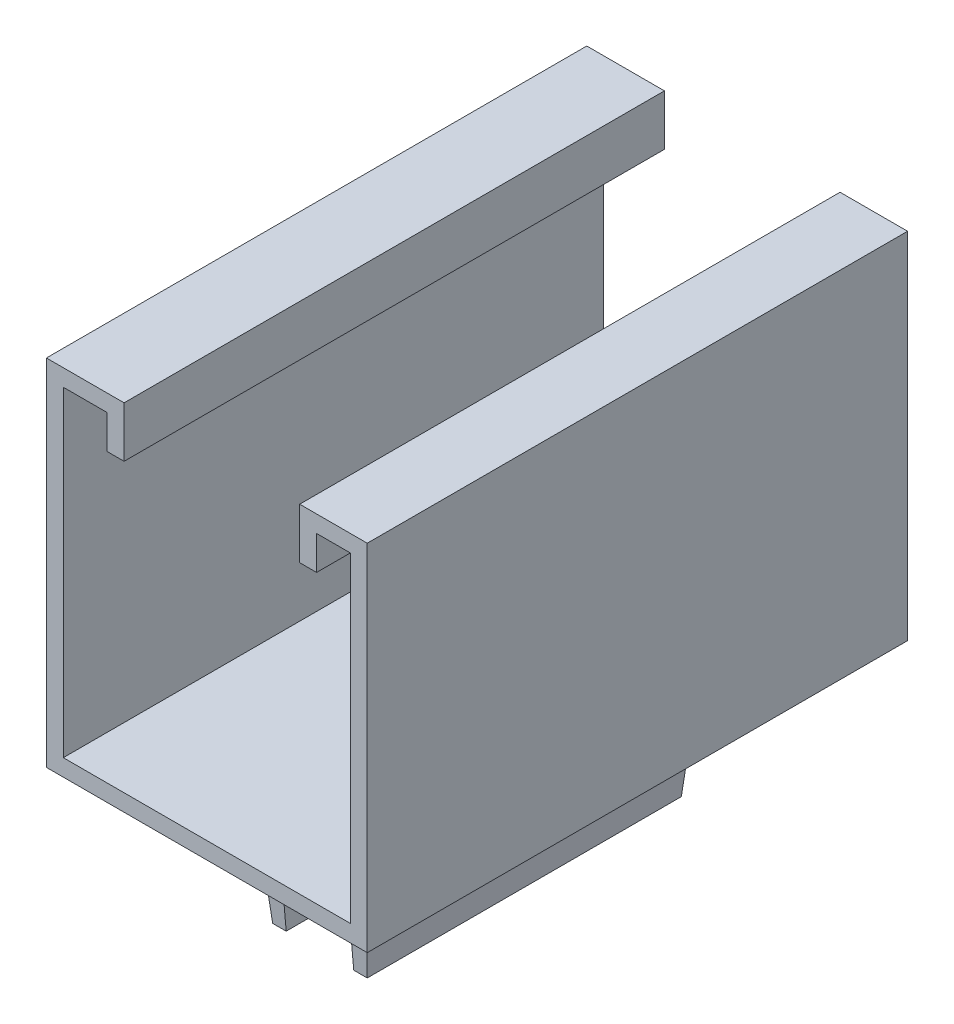
ISO-10303-21;
HEADER;
FILE_DESCRIPTION(('STEP AP214'),'2;1');
FILE_NAME('part.step','',(''),(''),'','','');
FILE_SCHEMA(('AUTOMOTIVE_DESIGN { 1 0 10303 214 1 1 1 1 }'));
ENDSEC;
DATA;
#1=APPLICATION_CONTEXT('core data for automotive mechanical design processes');
#2=APPLICATION_PROTOCOL_DEFINITION('international standard','automotive_design',2000,#1);
#3=PRODUCT_CONTEXT('',#1,'mechanical');
#4=PRODUCT('Part','Part','',(#3));
#5=PRODUCT_RELATED_PRODUCT_CATEGORY('part','',(#4));
#6=PRODUCT_DEFINITION_FORMATION('','',#4);
#7=PRODUCT_DEFINITION_CONTEXT('part definition',#1,'design');
#8=PRODUCT_DEFINITION('design','',#6,#7);
#9=PRODUCT_DEFINITION_SHAPE('','',#8);
#10=(LENGTH_UNIT() NAMED_UNIT(*) SI_UNIT(.MILLI.,.METRE.));
#11=(NAMED_UNIT(*) PLANE_ANGLE_UNIT() SI_UNIT($,.RADIAN.));
#12=(NAMED_UNIT(*) SI_UNIT($,.STERADIAN.) SOLID_ANGLE_UNIT());
#13=UNCERTAINTY_MEASURE_WITH_UNIT(LENGTH_MEASURE(1.E-05),#10,'distance_accuracy_value','');
#14=(GEOMETRIC_REPRESENTATION_CONTEXT(3) GLOBAL_UNCERTAINTY_ASSIGNED_CONTEXT((#13)) GLOBAL_UNIT_ASSIGNED_CONTEXT((#10,
#11,#12)) REPRESENTATION_CONTEXT('',''));
#15=CARTESIAN_POINT('',(0.,0.,0.));
#16=DIRECTION('',(0.,0.,1.));
#17=DIRECTION('',(1.,0.,0.));
#18=AXIS2_PLACEMENT_3D('',#15,#16,#17);
#19=CARTESIAN_POINT('',(15.875,-63.5,82.55));
#20=DIRECTION('',(0.,-0.0871557427476584,0.996194698091746));
#21=DIRECTION('',(0.,-0.996194698091746,-0.0871557427476584));
#22=AXIS2_PLACEMENT_3D('',#19,#20,#21);
#23=PLANE('',#22);
#24=DIRECTION('',(1.,0.,0.));
#25=VECTOR('',#24,1.);
#26=CARTESIAN_POINT('',(0.,-88.9,80.3277879464415));
#27=LINE('',#26,#25);
#28=CARTESIAN_POINT('',(18.0972120535585,-88.9,80.3277879464415));
#29=VERTEX_POINT('',#28);
#30=CARTESIAN_POINT('',(20.6375,-88.9,80.3277879464415));
#31=VERTEX_POINT('',#30);
#32=EDGE_CURVE('E228',#29,#31,#27,.T.);
#33=ORIENTED_EDGE('',*,*,#32,.T.);
#34=DIRECTION('',(0.,0.996194698091746,0.0871557427476584));
#35=VECTOR('',#34,1.);
#36=CARTESIAN_POINT('',(20.6375,-63.5,82.55));
#37=LINE('',#36,#35);
#38=CARTESIAN_POINT('',(20.6375,-63.5,82.55));
#39=VERTEX_POINT('',#38);
#40=EDGE_CURVE('E212',#31,#39,#37,.T.);
#41=ORIENTED_EDGE('',*,*,#40,.T.);
#42=DIRECTION('',(1.,0.,0.));
#43=VECTOR('',#42,1.);
#44=CARTESIAN_POINT('',(15.875,-63.5,82.55));
#45=LINE('',#44,#43);
#46=CARTESIAN_POINT('',(15.875,-63.5,82.55));
#47=VERTEX_POINT('',#46);
#48=EDGE_CURVE('E226',#47,#39,#45,.T.);
#49=ORIENTED_EDGE('',*,*,#48,.F.);
#50=DIRECTION('',(0.0868265938642475,-0.992432509138967,-0.0868265938642478));
#51=VECTOR('',#50,1.);
#52=CARTESIAN_POINT('',(15.875,-63.5,82.55));
#53=LINE('',#52,#51);
#54=EDGE_CURVE('E251',#29,#47,#53,.F.);
#55=ORIENTED_EDGE('',*,*,#54,.F.);
#56=EDGE_LOOP('',(#33,#41,#49,#55));
#57=FACE_BOUND('',#56,.T.);
#58=ADVANCED_FACE('F45',(#57),#23,.T.);
#59=CARTESIAN_POINT('',(15.875,-63.5,19.05));
#60=DIRECTION('',(0.,-0.0871557427476584,-0.996194698091746));
#61=DIRECTION('',(0.,0.996194698091746,-0.0871557427476584));
#62=AXIS2_PLACEMENT_3D('',#59,#60,#61);
#63=PLANE('',#62);
#64=DIRECTION('',(0.,-0.996194698091746,0.0871557427476584));
#65=VECTOR('',#64,1.);
#66=CARTESIAN_POINT('',(20.6375,-63.5,19.05));
#67=LINE('',#66,#65);
#68=CARTESIAN_POINT('',(20.6375,-88.9,21.2722120535585));
#69=VERTEX_POINT('',#68);
#70=CARTESIAN_POINT('',(20.6375,-63.5,19.05));
#71=VERTEX_POINT('',#70);
#72=EDGE_CURVE('E215',#69,#71,#67,.F.);
#73=ORIENTED_EDGE('',*,*,#72,.F.);
#74=DIRECTION('',(-1.,0.,0.));
#75=VECTOR('',#74,1.);
#76=CARTESIAN_POINT('',(0.,-88.9,21.2722120535585));
#77=LINE('',#76,#75);
#78=CARTESIAN_POINT('',(18.0972120535585,-88.9,21.2722120535585));
#79=VERTEX_POINT('',#78);
#80=EDGE_CURVE('E272',#79,#69,#77,.F.);
#81=ORIENTED_EDGE('',*,*,#80,.F.);
#82=DIRECTION('',(-0.0868265938642475,0.992432509138967,-0.0868265938642478));
#83=VECTOR('',#82,1.);
#84=CARTESIAN_POINT('',(15.875,-63.5,19.05));
#85=LINE('',#84,#83);
#86=CARTESIAN_POINT('',(15.875,-63.5,19.05));
#87=VERTEX_POINT('',#86);
#88=EDGE_CURVE('E255',#79,#87,#85,.T.);
#89=ORIENTED_EDGE('',*,*,#88,.T.);
#90=DIRECTION('',(1.,0.,0.));
#91=VECTOR('',#90,1.);
#92=CARTESIAN_POINT('',(15.875,-63.5,19.05));
#93=LINE('',#92,#91);
#94=EDGE_CURVE('E245',#87,#71,#93,.T.);
#95=ORIENTED_EDGE('',*,*,#94,.T.);
#96=EDGE_LOOP('',(#73,#81,#89,#95));
#97=FACE_BOUND('',#96,.T.);
#98=ADVANCED_FACE('F525',(#97),#63,.T.);
#99=CARTESIAN_POINT('',(0.,-88.9,0.));
#100=DIRECTION('',(0.,1.,0.));
#101=DIRECTION('',(-1.,0.,0.));
#102=AXIS2_PLACEMENT_3D('',#99,#100,#101);
#103=PLANE('',#102);
#104=DIRECTION('',(0.,0.,-1.));
#105=VECTOR('',#104,1.);
#106=CARTESIAN_POINT('',(20.6375,-88.9,0.));
#107=LINE('',#106,#105);
#108=EDGE_CURVE('E11',#31,#69,#107,.T.);
#109=ORIENTED_EDGE('',*,*,#108,.F.);
#110=ORIENTED_EDGE('',*,*,#32,.F.);
#111=DIRECTION('',(0.,0.,1.));
#112=VECTOR('',#111,1.);
#113=CARTESIAN_POINT('',(18.0972120535585,-88.9,0.));
#114=LINE('',#113,#112);
#115=EDGE_CURVE('E260',#29,#79,#114,.F.);
#116=ORIENTED_EDGE('',*,*,#115,.T.);
#117=ORIENTED_EDGE('',*,*,#80,.T.);
#118=EDGE_LOOP('',(#109,#110,#116,#117));
#119=FACE_BOUND('',#118,.T.);
#120=ADVANCED_FACE('F512',(#119),#103,.F.);
#121=CARTESIAN_POINT('',(0.,0.,101.6));
#122=DIRECTION('',(0.,1.,0.));
#123=DIRECTION('',(0.,0.,1.));
#124=AXIS2_PLACEMENT_3D('',#121,#122,#123);
#125=PLANE('',#124);
#126=DIRECTION('',(1.,0.,0.));
#127=VECTOR('',#126,1.);
#128=CARTESIAN_POINT('',(0.,0.,0.));
#129=LINE('',#128,#127);
#130=CARTESIAN_POINT('',(0.,0.,0.));
#131=VERTEX_POINT('',#130);
#132=CARTESIAN_POINT('',(8.255,0.,0.));
#133=VERTEX_POINT('',#132);
#134=EDGE_CURVE('E254',#131,#133,#129,.T.);
#135=ORIENTED_EDGE('',*,*,#134,.T.);
#136=DIRECTION('',(0.,0.,-1.));
#137=VECTOR('',#136,1.);
#138=CARTESIAN_POINT('',(8.255,0.,101.6));
#139=LINE('',#138,#137);
#140=CARTESIAN_POINT('',(8.255,0.,101.6));
#141=VERTEX_POINT('',#140);
#142=EDGE_CURVE('E437',#141,#133,#139,.T.);
#143=ORIENTED_EDGE('',*,*,#142,.F.);
#144=DIRECTION('',(1.,0.,0.));
#145=VECTOR('',#144,1.);
#146=CARTESIAN_POINT('',(0.,0.,101.6));
#147=LINE('',#146,#145);
#148=CARTESIAN_POINT('',(0.,0.,101.6));
#149=VERTEX_POINT('',#148);
#150=EDGE_CURVE('E280',#149,#141,#147,.T.);
#151=ORIENTED_EDGE('',*,*,#150,.F.);
#152=DIRECTION('',(0.,0.,-1.));
#153=VECTOR('',#152,1.);
#154=CARTESIAN_POINT('',(0.,0.,101.6));
#155=LINE('',#154,#153);
#156=EDGE_CURVE('E330',#149,#131,#155,.T.);
#157=ORIENTED_EDGE('',*,*,#156,.T.);
#158=EDGE_LOOP('',(#135,#143,#151,#157));
#159=FACE_BOUND('',#158,.T.);
#160=ADVANCED_FACE('F47',(#159),#125,.F.);
#161=CARTESIAN_POINT('',(8.255,0.,101.6));
#162=DIRECTION('',(1.,0.,0.));
#163=DIRECTION('',(0.,0.,-1.));
#164=AXIS2_PLACEMENT_3D('',#161,#162,#163);
#165=PLANE('',#164);
#166=DIRECTION('',(0.,-1.,0.));
#167=VECTOR('',#166,1.);
#168=CARTESIAN_POINT('',(8.255,0.,0.));
#169=LINE('',#168,#167);
#170=CARTESIAN_POINT('',(8.255,-6.35,0.));
#171=VERTEX_POINT('',#170);
#172=EDGE_CURVE('E334',#133,#171,#169,.T.);
#173=ORIENTED_EDGE('',*,*,#172,.T.);
#174=DIRECTION('',(0.,0.,-1.));
#175=VECTOR('',#174,1.);
#176=CARTESIAN_POINT('',(8.255,-6.35,101.6));
#177=LINE('',#176,#175);
#178=CARTESIAN_POINT('',(8.255,-6.35,101.6));
#179=VERTEX_POINT('',#178);
#180=EDGE_CURVE('E433',#179,#171,#177,.T.);
#181=ORIENTED_EDGE('',*,*,#180,.F.);
#182=DIRECTION('',(0.,-1.,0.));
#183=VECTOR('',#182,1.);
#184=CARTESIAN_POINT('',(8.255,0.,101.6));
#185=LINE('',#184,#183);
#186=EDGE_CURVE('E284',#141,#179,#185,.T.);
#187=ORIENTED_EDGE('',*,*,#186,.F.);
#188=ORIENTED_EDGE('',*,*,#142,.T.);
#189=EDGE_LOOP('',(#173,#181,#187,#188));
#190=FACE_BOUND('',#189,.T.);
#191=ADVANCED_FACE('F603',(#190),#165,.F.);
#192=CARTESIAN_POINT('',(8.255,-6.35,101.6));
#193=DIRECTION('',(0.,1.,0.));
#194=DIRECTION('',(0.,0.,1.));
#195=AXIS2_PLACEMENT_3D('',#192,#193,#194);
#196=PLANE('',#195);
#197=DIRECTION('',(1.,0.,0.));
#198=VECTOR('',#197,1.);
#199=CARTESIAN_POINT('',(8.255,-6.35,0.));
#200=LINE('',#199,#198);
#201=CARTESIAN_POINT('',(11.43,-6.35,0.));
#202=VERTEX_POINT('',#201);
#203=EDGE_CURVE('E337',#171,#202,#200,.T.);
#204=ORIENTED_EDGE('',*,*,#203,.T.);
#205=DIRECTION('',(0.,0.,-1.));
#206=VECTOR('',#205,1.);
#207=CARTESIAN_POINT('',(11.43,-6.35,101.6));
#208=LINE('',#207,#206);
#209=CARTESIAN_POINT('',(11.43,-6.35,101.6));
#210=VERTEX_POINT('',#209);
#211=EDGE_CURVE('E429',#210,#202,#208,.T.);
#212=ORIENTED_EDGE('',*,*,#211,.F.);
#213=DIRECTION('',(1.,0.,0.));
#214=VECTOR('',#213,1.);
#215=CARTESIAN_POINT('',(8.255,-6.35,101.6));
#216=LINE('',#215,#214);
#217=EDGE_CURVE('E288',#179,#210,#216,.T.);
#218=ORIENTED_EDGE('',*,*,#217,.F.);
#219=ORIENTED_EDGE('',*,*,#180,.T.);
#220=EDGE_LOOP('',(#204,#212,#218,#219));
#221=FACE_BOUND('',#220,.T.);
#222=ADVANCED_FACE('F600',(#221),#196,.F.);
#223=CARTESIAN_POINT('',(11.43,3.175,101.6));
#224=DIRECTION('',(-1.,0.,0.));
#225=DIRECTION('',(0.,0.,1.));
#226=AXIS2_PLACEMENT_3D('',#223,#224,#225);
#227=PLANE('',#226);
#228=DIRECTION('',(0.,1.,0.));
#229=VECTOR('',#228,1.);
#230=CARTESIAN_POINT('',(11.43,3.175,0.));
#231=LINE('',#230,#229);
#232=CARTESIAN_POINT('',(11.43,3.175,0.));
#233=VERTEX_POINT('',#232);
#234=EDGE_CURVE('E340',#202,#233,#231,.T.);
#235=ORIENTED_EDGE('',*,*,#234,.T.);
#236=DIRECTION('',(0.,0.,-1.));
#237=VECTOR('',#236,1.);
#238=CARTESIAN_POINT('',(11.43,3.175,101.6));
#239=LINE('',#238,#237);
#240=CARTESIAN_POINT('',(11.43,3.175,101.6));
#241=VERTEX_POINT('',#240);
#242=EDGE_CURVE('E425',#241,#233,#239,.T.);
#243=ORIENTED_EDGE('',*,*,#242,.F.);
#244=DIRECTION('',(0.,1.,0.));
#245=VECTOR('',#244,1.);
#246=CARTESIAN_POINT('',(11.43,3.175,101.6));
#247=LINE('',#246,#245);
#248=EDGE_CURVE('E291',#210,#241,#247,.T.);
#249=ORIENTED_EDGE('',*,*,#248,.F.);
#250=ORIENTED_EDGE('',*,*,#211,.T.);
#251=EDGE_LOOP('',(#235,#243,#249,#250));
#252=FACE_BOUND('',#251,.T.);
#253=ADVANCED_FACE('F596',(#252),#227,.F.);
#254=CARTESIAN_POINT('',(-3.175,3.175,101.6));
#255=DIRECTION('',(0.,-1.,0.));
#256=DIRECTION('',(0.,0.,-1.));
#257=AXIS2_PLACEMENT_3D('',#254,#255,#256);
#258=PLANE('',#257);
#259=DIRECTION('',(-1.,0.,0.));
#260=VECTOR('',#259,1.);
#261=CARTESIAN_POINT('',(-3.175,3.175,0.));
#262=LINE('',#261,#260);
#263=CARTESIAN_POINT('',(-3.175,3.175,0.));
#264=VERTEX_POINT('',#263);
#265=EDGE_CURVE('E343',#233,#264,#262,.T.);
#266=ORIENTED_EDGE('',*,*,#265,.T.);
#267=DIRECTION('',(0.,0.,-1.));
#268=VECTOR('',#267,1.);
#269=CARTESIAN_POINT('',(-3.175,3.175,101.6));
#270=LINE('',#269,#268);
#271=CARTESIAN_POINT('',(-3.175,3.175,101.6));
#272=VERTEX_POINT('',#271);
#273=EDGE_CURVE('E421',#272,#264,#270,.T.);
#274=ORIENTED_EDGE('',*,*,#273,.F.);
#275=DIRECTION('',(-1.,0.,0.));
#276=VECTOR('',#275,1.);
#277=CARTESIAN_POINT('',(-3.175,3.175,101.6));
#278=LINE('',#277,#276);
#279=EDGE_CURVE('E294',#241,#272,#278,.T.);
#280=ORIENTED_EDGE('',*,*,#279,.F.);
#281=ORIENTED_EDGE('',*,*,#242,.T.);
#282=EDGE_LOOP('',(#266,#274,#280,#281));
#283=FACE_BOUND('',#282,.T.);
#284=ADVANCED_FACE('F592',(#283),#258,.F.);
#285=CARTESIAN_POINT('',(-3.175,3.175,101.6));
#286=DIRECTION('',(1.,0.,0.));
#287=DIRECTION('',(0.,1.,0.));
#288=AXIS2_PLACEMENT_3D('',#285,#286,#287);
#289=PLANE('',#288);
#290=DIRECTION('',(0.,-1.,0.));
#291=VECTOR('',#290,1.);
#292=CARTESIAN_POINT('',(-3.175,3.175,0.));
#293=LINE('',#292,#291);
#294=CARTESIAN_POINT('',(-3.17499999999999,-63.5,0.));
#295=VERTEX_POINT('',#294);
#296=EDGE_CURVE('E346',#264,#295,#293,.T.);
#297=ORIENTED_EDGE('',*,*,#296,.T.);
#298=DIRECTION('',(0.,0.,-1.));
#299=VECTOR('',#298,1.);
#300=CARTESIAN_POINT('',(-3.17499999999999,-63.5,101.6));
#301=LINE('',#300,#299);
#302=CARTESIAN_POINT('',(-3.17499999999999,-63.5,101.6));
#303=VERTEX_POINT('',#302);
#304=EDGE_CURVE('E417',#303,#295,#301,.T.);
#305=ORIENTED_EDGE('',*,*,#304,.F.);
#306=DIRECTION('',(0.,-1.,0.));
#307=VECTOR('',#306,1.);
#308=CARTESIAN_POINT('',(-3.175,3.175,101.6));
#309=LINE('',#308,#307);
#310=EDGE_CURVE('E297',#272,#303,#309,.T.);
#311=ORIENTED_EDGE('',*,*,#310,.F.);
#312=ORIENTED_EDGE('',*,*,#273,.T.);
#313=EDGE_LOOP('',(#297,#305,#311,#312));
#314=FACE_BOUND('',#313,.T.);
#315=ADVANCED_FACE('F589',(#314),#289,.F.);
#316=CARTESIAN_POINT('',(-3.17499999999999,-63.5,101.6));
#317=DIRECTION('',(0.,1.,0.));
#318=DIRECTION('',(-1.,0.,0.));
#319=AXIS2_PLACEMENT_3D('',#316,#317,#318);
#320=PLANE('',#319);
#321=DIRECTION('',(0.,0.,-1.));
#322=VECTOR('',#321,1.);
#323=CARTESIAN_POINT('',(33.3375,-63.5,0.));
#324=LINE('',#323,#322);
#325=CARTESIAN_POINT('',(33.3375,-63.5,82.55));
#326=VERTEX_POINT('',#325);
#327=CARTESIAN_POINT('',(33.3375,-63.5,19.05));
#328=VERTEX_POINT('',#327);
#329=EDGE_CURVE('E220',#326,#328,#324,.T.);
#330=ORIENTED_EDGE('',*,*,#329,.F.);
#331=CARTESIAN_POINT('',(38.1,-63.5,82.55));
#332=VERTEX_POINT('',#331);
#333=EDGE_CURVE('E71',#326,#332,#45,.T.);
#334=ORIENTED_EDGE('',*,*,#333,.T.);
#335=DIRECTION('',(0.,0.,-1.));
#336=VECTOR('',#335,1.);
#337=CARTESIAN_POINT('',(38.1,-63.5,82.55));
#338=LINE('',#337,#336);
#339=CARTESIAN_POINT('',(38.1,-63.5,19.05));
#340=VERTEX_POINT('',#339);
#341=EDGE_CURVE('E237',#332,#340,#338,.T.);
#342=ORIENTED_EDGE('',*,*,#341,.T.);
#343=EDGE_CURVE('E241',#328,#340,#93,.T.);
#344=ORIENTED_EDGE('',*,*,#343,.F.);
#345=EDGE_LOOP('',(#330,#334,#342,#344));
#346=FACE_BOUND('',#345,.T.);
#347=DIRECTION('',(0.,0.,-1.));
#348=VECTOR('',#347,1.);
#349=CARTESIAN_POINT('',(15.875,-63.5,82.55));
#350=LINE('',#349,#348);
#351=EDGE_CURVE('E234',#47,#87,#350,.T.);
#352=ORIENTED_EDGE('',*,*,#351,.F.);
#353=ORIENTED_EDGE('',*,*,#48,.T.);
#354=DIRECTION('',(0.,0.,-1.));
#355=VECTOR('',#354,1.);
#356=CARTESIAN_POINT('',(20.6375,-63.5,0.));
#357=LINE('',#356,#355);
#358=EDGE_CURVE('E209',#39,#71,#357,.T.);
#359=ORIENTED_EDGE('',*,*,#358,.T.);
#360=ORIENTED_EDGE('',*,*,#94,.F.);
#361=EDGE_LOOP('',(#352,#353,#359,#360));
#362=FACE_BOUND('',#361,.T.);
#363=DIRECTION('',(1.,0.,0.));
#364=VECTOR('',#363,1.);
#365=CARTESIAN_POINT('',(-3.17499999999999,-63.5,0.));
#366=LINE('',#365,#364);
#367=CARTESIAN_POINT('',(57.15,-63.5,0.));
#368=VERTEX_POINT('',#367);
#369=EDGE_CURVE('E349',#295,#368,#366,.T.);
#370=ORIENTED_EDGE('',*,*,#369,.T.);
#371=DIRECTION('',(0.,0.,-1.));
#372=VECTOR('',#371,1.);
#373=CARTESIAN_POINT('',(57.15,-63.5,101.6));
#374=LINE('',#373,#372);
#375=CARTESIAN_POINT('',(57.15,-63.5,101.6));
#376=VERTEX_POINT('',#375);
#377=EDGE_CURVE('E413',#376,#368,#374,.T.);
#378=ORIENTED_EDGE('',*,*,#377,.F.);
#379=DIRECTION('',(1.,0.,0.));
#380=VECTOR('',#379,1.);
#381=CARTESIAN_POINT('',(-3.17499999999999,-63.5,101.6));
#382=LINE('',#381,#380);
#383=EDGE_CURVE('E300',#303,#376,#382,.T.);
#384=ORIENTED_EDGE('',*,*,#383,.F.);
#385=ORIENTED_EDGE('',*,*,#304,.T.);
#386=EDGE_LOOP('',(#370,#378,#384,#385));
#387=FACE_BOUND('',#386,.T.);
#388=ADVANCED_FACE('F231',(#346,#362,#387),#320,.F.);
#389=CARTESIAN_POINT('',(57.15,-63.5,101.6));
#390=DIRECTION('',(-1.,0.,0.));
#391=DIRECTION('',(0.,-1.,0.));
#392=AXIS2_PLACEMENT_3D('',#389,#390,#391);
#393=PLANE('',#392);
#394=DIRECTION('',(0.,1.,0.));
#395=VECTOR('',#394,1.);
#396=CARTESIAN_POINT('',(57.15,-63.5,0.));
#397=LINE('',#396,#395);
#398=CARTESIAN_POINT('',(57.15,3.175,0.));
#399=VERTEX_POINT('',#398);
#400=EDGE_CURVE('E352',#368,#399,#397,.T.);
#401=ORIENTED_EDGE('',*,*,#400,.T.);
#402=DIRECTION('',(0.,0.,-1.));
#403=VECTOR('',#402,1.);
#404=CARTESIAN_POINT('',(57.15,3.175,101.6));
#405=LINE('',#404,#403);
#406=CARTESIAN_POINT('',(57.15,3.175,101.6));
#407=VERTEX_POINT('',#406);
#408=EDGE_CURVE('E409',#407,#399,#405,.T.);
#409=ORIENTED_EDGE('',*,*,#408,.F.);
#410=DIRECTION('',(0.,1.,0.));
#411=VECTOR('',#410,1.);
#412=CARTESIAN_POINT('',(57.15,-63.5,101.6));
#413=LINE('',#412,#411);
#414=EDGE_CURVE('E303',#376,#407,#413,.T.);
#415=ORIENTED_EDGE('',*,*,#414,.F.);
#416=ORIENTED_EDGE('',*,*,#377,.T.);
#417=EDGE_LOOP('',(#401,#409,#415,#416));
#418=FACE_BOUND('',#417,.T.);
#419=ADVANCED_FACE('F583',(#418),#393,.F.);
#420=CARTESIAN_POINT('',(57.15,3.175,101.6));
#421=DIRECTION('',(0.,-1.,0.));
#422=DIRECTION('',(1.,0.,0.));
#423=AXIS2_PLACEMENT_3D('',#420,#421,#422);
#424=PLANE('',#423);
#425=DIRECTION('',(-1.,0.,0.));
#426=VECTOR('',#425,1.);
#427=CARTESIAN_POINT('',(57.15,3.175,0.));
#428=LINE('',#427,#426);
#429=CARTESIAN_POINT('',(44.45,3.175,0.));
#430=VERTEX_POINT('',#429);
#431=EDGE_CURVE('E355',#399,#430,#428,.T.);
#432=ORIENTED_EDGE('',*,*,#431,.T.);
#433=DIRECTION('',(0.,0.,-1.));
#434=VECTOR('',#433,1.);
#435=CARTESIAN_POINT('',(44.45,3.175,101.6));
#436=LINE('',#435,#434);
#437=CARTESIAN_POINT('',(44.45,3.175,101.6));
#438=VERTEX_POINT('',#437);
#439=EDGE_CURVE('E405',#438,#430,#436,.T.);
#440=ORIENTED_EDGE('',*,*,#439,.F.);
#441=DIRECTION('',(-1.,0.,0.));
#442=VECTOR('',#441,1.);
#443=CARTESIAN_POINT('',(57.15,3.175,101.6));
#444=LINE('',#443,#442);
#445=EDGE_CURVE('E306',#407,#438,#444,.T.);
#446=ORIENTED_EDGE('',*,*,#445,.F.);
#447=ORIENTED_EDGE('',*,*,#408,.T.);
#448=EDGE_LOOP('',(#432,#440,#446,#447));
#449=FACE_BOUND('',#448,.T.);
#450=ADVANCED_FACE('F579',(#449),#424,.F.);
#451=CARTESIAN_POINT('',(44.45,3.175,101.6));
#452=DIRECTION('',(1.,0.,0.));
#453=DIRECTION('',(0.,0.,-1.));
#454=AXIS2_PLACEMENT_3D('',#451,#452,#453);
#455=PLANE('',#454);
#456=DIRECTION('',(0.,-1.,0.));
#457=VECTOR('',#456,1.);
#458=CARTESIAN_POINT('',(44.45,3.175,0.));
#459=LINE('',#458,#457);
#460=CARTESIAN_POINT('',(44.45,-6.35,0.));
#461=VERTEX_POINT('',#460);
#462=EDGE_CURVE('E358',#430,#461,#459,.T.);
#463=ORIENTED_EDGE('',*,*,#462,.T.);
#464=DIRECTION('',(0.,0.,-1.));
#465=VECTOR('',#464,1.);
#466=CARTESIAN_POINT('',(44.45,-6.35,101.6));
#467=LINE('',#466,#465);
#468=CARTESIAN_POINT('',(44.45,-6.35,101.6));
#469=VERTEX_POINT('',#468);
#470=EDGE_CURVE('E401',#469,#461,#467,.T.);
#471=ORIENTED_EDGE('',*,*,#470,.F.);
#472=DIRECTION('',(0.,-1.,0.));
#473=VECTOR('',#472,1.);
#474=CARTESIAN_POINT('',(44.45,3.175,101.6));
#475=LINE('',#474,#473);
#476=EDGE_CURVE('E309',#438,#469,#475,.T.);
#477=ORIENTED_EDGE('',*,*,#476,.F.);
#478=ORIENTED_EDGE('',*,*,#439,.T.);
#479=EDGE_LOOP('',(#463,#471,#477,#478));
#480=FACE_BOUND('',#479,.T.);
#481=ADVANCED_FACE('F575',(#480),#455,.F.);
#482=CARTESIAN_POINT('',(44.45,-6.35,101.6));
#483=DIRECTION('',(0.,1.,0.));
#484=DIRECTION('',(0.,0.,1.));
#485=AXIS2_PLACEMENT_3D('',#482,#483,#484);
#486=PLANE('',#485);
#487=DIRECTION('',(1.,0.,0.));
#488=VECTOR('',#487,1.);
#489=CARTESIAN_POINT('',(44.45,-6.35,0.));
#490=LINE('',#489,#488);
#491=CARTESIAN_POINT('',(47.625,-6.35,0.));
#492=VERTEX_POINT('',#491);
#493=EDGE_CURVE('E361',#461,#492,#490,.T.);
#494=ORIENTED_EDGE('',*,*,#493,.T.);
#495=DIRECTION('',(0.,0.,-1.));
#496=VECTOR('',#495,1.);
#497=CARTESIAN_POINT('',(47.625,-6.35,101.6));
#498=LINE('',#497,#496);
#499=CARTESIAN_POINT('',(47.625,-6.35,101.6));
#500=VERTEX_POINT('',#499);
#501=EDGE_CURVE('E397',#500,#492,#498,.T.);
#502=ORIENTED_EDGE('',*,*,#501,.F.);
#503=DIRECTION('',(1.,0.,0.));
#504=VECTOR('',#503,1.);
#505=CARTESIAN_POINT('',(44.45,-6.35,101.6));
#506=LINE('',#505,#504);
#507=EDGE_CURVE('E312',#469,#500,#506,.T.);
#508=ORIENTED_EDGE('',*,*,#507,.F.);
#509=ORIENTED_EDGE('',*,*,#470,.T.);
#510=EDGE_LOOP('',(#494,#502,#508,#509));
#511=FACE_BOUND('',#510,.T.);
#512=ADVANCED_FACE('F571',(#511),#486,.F.);
#513=CARTESIAN_POINT('',(47.625,0.,101.6));
#514=DIRECTION('',(-1.,0.,0.));
#515=DIRECTION('',(0.,0.,1.));
#516=AXIS2_PLACEMENT_3D('',#513,#514,#515);
#517=PLANE('',#516);
#518=DIRECTION('',(0.,1.,0.));
#519=VECTOR('',#518,1.);
#520=CARTESIAN_POINT('',(47.625,0.,0.));
#521=LINE('',#520,#519);
#522=CARTESIAN_POINT('',(47.625,0.,0.));
#523=VERTEX_POINT('',#522);
#524=EDGE_CURVE('E364',#492,#523,#521,.T.);
#525=ORIENTED_EDGE('',*,*,#524,.T.);
#526=DIRECTION('',(0.,0.,-1.));
#527=VECTOR('',#526,1.);
#528=CARTESIAN_POINT('',(47.625,0.,101.6));
#529=LINE('',#528,#527);
#530=CARTESIAN_POINT('',(47.625,0.,101.6));
#531=VERTEX_POINT('',#530);
#532=EDGE_CURVE('E393',#531,#523,#529,.T.);
#533=ORIENTED_EDGE('',*,*,#532,.F.);
#534=DIRECTION('',(0.,1.,0.));
#535=VECTOR('',#534,1.);
#536=CARTESIAN_POINT('',(47.625,0.,101.6));
#537=LINE('',#536,#535);
#538=EDGE_CURVE('E315',#500,#531,#537,.T.);
#539=ORIENTED_EDGE('',*,*,#538,.F.);
#540=ORIENTED_EDGE('',*,*,#501,.T.);
#541=EDGE_LOOP('',(#525,#533,#539,#540));
#542=FACE_BOUND('',#541,.T.);
#543=ADVANCED_FACE('F567',(#542),#517,.F.);
#544=CARTESIAN_POINT('',(53.975,0.,101.6));
#545=DIRECTION('',(0.,1.,0.));
#546=DIRECTION('',(-1.,0.,0.));
#547=AXIS2_PLACEMENT_3D('',#544,#545,#546);
#548=PLANE('',#547);
#549=DIRECTION('',(1.,0.,0.));
#550=VECTOR('',#549,1.);
#551=CARTESIAN_POINT('',(53.975,0.,0.));
#552=LINE('',#551,#550);
#553=CARTESIAN_POINT('',(53.975,0.,0.));
#554=VERTEX_POINT('',#553);
#555=EDGE_CURVE('E367',#523,#554,#552,.T.);
#556=ORIENTED_EDGE('',*,*,#555,.T.);
#557=DIRECTION('',(0.,0.,-1.));
#558=VECTOR('',#557,1.);
#559=CARTESIAN_POINT('',(53.975,0.,101.6));
#560=LINE('',#559,#558);
#561=CARTESIAN_POINT('',(53.975,0.,101.6));
#562=VERTEX_POINT('',#561);
#563=EDGE_CURVE('E389',#562,#554,#560,.T.);
#564=ORIENTED_EDGE('',*,*,#563,.F.);
#565=DIRECTION('',(1.,0.,0.));
#566=VECTOR('',#565,1.);
#567=CARTESIAN_POINT('',(53.975,0.,101.6));
#568=LINE('',#567,#566);
#569=EDGE_CURVE('E318',#531,#562,#568,.T.);
#570=ORIENTED_EDGE('',*,*,#569,.F.);
#571=ORIENTED_EDGE('',*,*,#532,.T.);
#572=EDGE_LOOP('',(#556,#564,#570,#571));
#573=FACE_BOUND('',#572,.T.);
#574=ADVANCED_FACE('F563',(#573),#548,.F.);
#575=CARTESIAN_POINT('',(53.975,-60.325,101.6));
#576=DIRECTION('',(1.,0.,0.));
#577=DIRECTION('',(0.,1.,0.));
#578=AXIS2_PLACEMENT_3D('',#575,#576,#577);
#579=PLANE('',#578);
#580=DIRECTION('',(0.,-1.,0.));
#581=VECTOR('',#580,1.);
#582=CARTESIAN_POINT('',(53.975,-60.325,0.));
#583=LINE('',#582,#581);
#584=CARTESIAN_POINT('',(53.975,-60.325,0.));
#585=VERTEX_POINT('',#584);
#586=EDGE_CURVE('E370',#554,#585,#583,.T.);
#587=ORIENTED_EDGE('',*,*,#586,.T.);
#588=DIRECTION('',(0.,0.,-1.));
#589=VECTOR('',#588,1.);
#590=CARTESIAN_POINT('',(53.975,-60.325,101.6));
#591=LINE('',#590,#589);
#592=CARTESIAN_POINT('',(53.975,-60.325,101.6));
#593=VERTEX_POINT('',#592);
#594=EDGE_CURVE('E385',#593,#585,#591,.T.);
#595=ORIENTED_EDGE('',*,*,#594,.F.);
#596=DIRECTION('',(0.,-1.,0.));
#597=VECTOR('',#596,1.);
#598=CARTESIAN_POINT('',(53.975,-60.325,101.6));
#599=LINE('',#598,#597);
#600=EDGE_CURVE('E321',#562,#593,#599,.T.);
#601=ORIENTED_EDGE('',*,*,#600,.F.);
#602=ORIENTED_EDGE('',*,*,#563,.T.);
#603=EDGE_LOOP('',(#587,#595,#601,#602));
#604=FACE_BOUND('',#603,.T.);
#605=ADVANCED_FACE('F559',(#604),#579,.F.);
#606=CARTESIAN_POINT('',(0.,-60.325,101.6));
#607=DIRECTION('',(0.,-1.,0.));
#608=DIRECTION('',(0.,0.,-1.));
#609=AXIS2_PLACEMENT_3D('',#606,#607,#608);
#610=PLANE('',#609);
#611=DIRECTION('',(-1.,0.,0.));
#612=VECTOR('',#611,1.);
#613=CARTESIAN_POINT('',(0.,-60.325,0.));
#614=LINE('',#613,#612);
#615=CARTESIAN_POINT('',(0.,-60.325,0.));
#616=VERTEX_POINT('',#615);
#617=EDGE_CURVE('E373',#585,#616,#614,.T.);
#618=ORIENTED_EDGE('',*,*,#617,.T.);
#619=DIRECTION('',(0.,0.,-1.));
#620=VECTOR('',#619,1.);
#621=CARTESIAN_POINT('',(0.,-60.325,101.6));
#622=LINE('',#621,#620);
#623=CARTESIAN_POINT('',(0.,-60.325,101.6));
#624=VERTEX_POINT('',#623);
#625=EDGE_CURVE('E381',#624,#616,#622,.T.);
#626=ORIENTED_EDGE('',*,*,#625,.F.);
#627=DIRECTION('',(-1.,0.,0.));
#628=VECTOR('',#627,1.);
#629=CARTESIAN_POINT('',(0.,-60.325,101.6));
#630=LINE('',#629,#628);
#631=EDGE_CURVE('E324',#593,#624,#630,.T.);
#632=ORIENTED_EDGE('',*,*,#631,.F.);
#633=ORIENTED_EDGE('',*,*,#594,.T.);
#634=EDGE_LOOP('',(#618,#626,#632,#633));
#635=FACE_BOUND('',#634,.T.);
#636=ADVANCED_FACE('F555',(#635),#610,.F.);
#637=CARTESIAN_POINT('',(0.,0.,101.6));
#638=DIRECTION('',(-1.,0.,0.));
#639=DIRECTION('',(0.,-1.,0.));
#640=AXIS2_PLACEMENT_3D('',#637,#638,#639);
#641=PLANE('',#640);
#642=DIRECTION('',(0.,1.,0.));
#643=VECTOR('',#642,1.);
#644=CARTESIAN_POINT('',(0.,0.,0.));
#645=LINE('',#644,#643);
#646=EDGE_CURVE('E285',#616,#131,#645,.T.);
#647=ORIENTED_EDGE('',*,*,#646,.T.);
#648=ORIENTED_EDGE('',*,*,#156,.F.);
#649=DIRECTION('',(0.,1.,0.));
#650=VECTOR('',#649,1.);
#651=CARTESIAN_POINT('',(0.,0.,101.6));
#652=LINE('',#651,#650);
#653=EDGE_CURVE('E327',#624,#149,#652,.T.);
#654=ORIENTED_EDGE('',*,*,#653,.F.);
#655=ORIENTED_EDGE('',*,*,#625,.T.);
#656=EDGE_LOOP('',(#647,#648,#654,#655));
#657=FACE_BOUND('',#656,.T.);
#658=ADVANCED_FACE('F548',(#657),#641,.F.);
#659=CARTESIAN_POINT('',(0.,0.,101.6));
#660=DIRECTION('',(0.,0.,-1.));
#661=DIRECTION('',(-1.,0.,0.));
#662=AXIS2_PLACEMENT_3D('',#659,#660,#661);
#663=PLANE('',#662);
#664=ORIENTED_EDGE('',*,*,#150,.T.);
#665=ORIENTED_EDGE('',*,*,#186,.T.);
#666=ORIENTED_EDGE('',*,*,#217,.T.);
#667=ORIENTED_EDGE('',*,*,#248,.T.);
#668=ORIENTED_EDGE('',*,*,#279,.T.);
#669=ORIENTED_EDGE('',*,*,#310,.T.);
#670=ORIENTED_EDGE('',*,*,#383,.T.);
#671=ORIENTED_EDGE('',*,*,#414,.T.);
#672=ORIENTED_EDGE('',*,*,#445,.T.);
#673=ORIENTED_EDGE('',*,*,#476,.T.);
#674=ORIENTED_EDGE('',*,*,#507,.T.);
#675=ORIENTED_EDGE('',*,*,#538,.T.);
#676=ORIENTED_EDGE('',*,*,#569,.T.);
#677=ORIENTED_EDGE('',*,*,#600,.T.);
#678=ORIENTED_EDGE('',*,*,#631,.T.);
#679=ORIENTED_EDGE('',*,*,#653,.T.);
#680=EDGE_LOOP('',(#664,#665,#666,#667,#668,#669,#670,#671,#672,#673,#674,#675,#676,#677,#678,#679));
#681=FACE_BOUND('',#680,.T.);
#682=ADVANCED_FACE('F542',(#681),#663,.F.);
#683=CARTESIAN_POINT('',(0.,0.,0.));
#684=DIRECTION('',(0.,0.,-1.));
#685=DIRECTION('',(-1.,0.,0.));
#686=AXIS2_PLACEMENT_3D('',#683,#684,#685);
#687=PLANE('',#686);
#688=ORIENTED_EDGE('',*,*,#134,.F.);
#689=ORIENTED_EDGE('',*,*,#646,.F.);
#690=ORIENTED_EDGE('',*,*,#617,.F.);
#691=ORIENTED_EDGE('',*,*,#586,.F.);
#692=ORIENTED_EDGE('',*,*,#555,.F.);
#693=ORIENTED_EDGE('',*,*,#524,.F.);
#694=ORIENTED_EDGE('',*,*,#493,.F.);
#695=ORIENTED_EDGE('',*,*,#462,.F.);
#696=ORIENTED_EDGE('',*,*,#431,.F.);
#697=ORIENTED_EDGE('',*,*,#400,.F.);
#698=ORIENTED_EDGE('',*,*,#369,.F.);
#699=ORIENTED_EDGE('',*,*,#296,.F.);
#700=ORIENTED_EDGE('',*,*,#265,.F.);
#701=ORIENTED_EDGE('',*,*,#234,.F.);
#702=ORIENTED_EDGE('',*,*,#203,.F.);
#703=ORIENTED_EDGE('',*,*,#172,.F.);
#704=EDGE_LOOP('',(#688,#689,#690,#691,#692,#693,#694,#695,#696,#697,#698,#699,#700,#701,#702,#703));
#705=FACE_BOUND('',#704,.T.);
#706=ADVANCED_FACE('F536',(#705),#687,.T.);
#707=DIRECTION('',(0.,0.996194698091746,0.0871557427476584));
#708=VECTOR('',#707,1.);
#709=CARTESIAN_POINT('',(33.3375,-63.5,82.55));
#710=LINE('',#709,#708);
#711=CARTESIAN_POINT('',(33.3375,-88.9,80.3277879464415));
#712=VERTEX_POINT('',#711);
#713=EDGE_CURVE('E477',#712,#326,#710,.T.);
#714=ORIENTED_EDGE('',*,*,#713,.F.);
#715=CARTESIAN_POINT('',(35.8777879464415,-88.9,80.3277879464415));
#716=VERTEX_POINT('',#715);
#717=EDGE_CURVE('E250',#712,#716,#27,.T.);
#718=ORIENTED_EDGE('',*,*,#717,.T.);
#719=DIRECTION('',(0.086826593864248,0.992432509138967,0.0868265938642478));
#720=VECTOR('',#719,1.);
#721=CARTESIAN_POINT('',(37.9324488942391,-65.415117902233,82.3824488942391));
#722=LINE('',#721,#720);
#723=EDGE_CURVE('E256',#716,#332,#722,.T.);
#724=ORIENTED_EDGE('',*,*,#723,.T.);
#725=ORIENTED_EDGE('',*,*,#333,.F.);
#726=EDGE_LOOP('',(#714,#718,#724,#725));
#727=FACE_BOUND('',#726,.T.);
#728=ADVANCED_FACE('F495',(#727),#23,.T.);
#729=CARTESIAN_POINT('',(15.875,-63.5,82.55));
#730=DIRECTION('',(-0.996194698091746,-0.0871557427476581,0.));
#731=DIRECTION('',(0.0871557427476581,-0.996194698091746,0.));
#732=AXIS2_PLACEMENT_3D('',#729,#730,#731);
#733=PLANE('',#732);
#734=CARTESIAN_POINT('',(16.9861060267792,-76.2,66.1194469866104));
#735=DIRECTION('',(-0.996194698091746,-0.0871557427476581,0.));
#736=DIRECTION('',(-0.0871557427476581,0.996194698091746,0.));
#737=AXIS2_PLACEMENT_3D('',#734,#735,#736);
#738=ELLIPSE('',#737,3.18712798420013,3.175);
#739=CARTESIAN_POINT('',(16.7083295200844,-73.025,66.1194469866104));
#740=VERTEX_POINT('',#739);
#741=EDGE_CURVE('E221',#740,#740,#738,.T.);
#742=ORIENTED_EDGE('',*,*,#741,.F.);
#743=EDGE_LOOP('',(#742));
#744=FACE_BOUND('',#743,.T.);
#745=CARTESIAN_POINT('',(16.9861060267792,-76.2,35.4805530133896));
#746=DIRECTION('',(-0.996194698091746,-0.0871557427476581,0.));
#747=DIRECTION('',(-0.0871557427476581,0.996194698091746,0.));
#748=AXIS2_PLACEMENT_3D('',#745,#746,#747);
#749=ELLIPSE('',#748,3.18712798420013,3.175);
#750=CARTESIAN_POINT('',(16.7083295200844,-73.025,35.4805530133896));
#751=VERTEX_POINT('',#750);
#752=EDGE_CURVE('E456',#751,#751,#749,.T.);
#753=ORIENTED_EDGE('',*,*,#752,.F.);
#754=EDGE_LOOP('',(#753));
#755=FACE_BOUND('',#754,.T.);
#756=ORIENTED_EDGE('',*,*,#351,.T.);
#757=ORIENTED_EDGE('',*,*,#88,.F.);
#758=ORIENTED_EDGE('',*,*,#115,.F.);
#759=ORIENTED_EDGE('',*,*,#54,.T.);
#760=EDGE_LOOP('',(#756,#757,#758,#759));
#761=FACE_BOUND('',#760,.T.);
#762=ADVANCED_FACE('F535',(#744,#755,#761),#733,.T.);
#763=CARTESIAN_POINT('',(33.3375,-88.9,21.2722120535585));
#764=VERTEX_POINT('',#763);
#765=CARTESIAN_POINT('',(35.8777879464415,-88.9,21.2722120535585));
#766=VERTEX_POINT('',#765);
#767=EDGE_CURVE('E276',#764,#766,#77,.F.);
#768=ORIENTED_EDGE('',*,*,#767,.F.);
#769=DIRECTION('',(0.,-0.996194698091746,0.0871557427476584));
#770=VECTOR('',#769,1.);
#771=CARTESIAN_POINT('',(33.3375,-63.5,19.05));
#772=LINE('',#771,#770);
#773=EDGE_CURVE('E63',#764,#328,#772,.F.);
#774=ORIENTED_EDGE('',*,*,#773,.T.);
#775=ORIENTED_EDGE('',*,*,#343,.T.);
#776=DIRECTION('',(-0.086826593864248,-0.992432509138967,0.0868265938642478));
#777=VECTOR('',#776,1.);
#778=CARTESIAN_POINT('',(37.9324488942391,-65.415117902233,19.2175511057609));
#779=LINE('',#778,#777);
#780=EDGE_CURVE('E259',#766,#340,#779,.F.);
#781=ORIENTED_EDGE('',*,*,#780,.F.);
#782=EDGE_LOOP('',(#768,#774,#775,#781));
#783=FACE_BOUND('',#782,.T.);
#784=ADVANCED_FACE('F504',(#783),#63,.T.);
#785=CARTESIAN_POINT('',(38.1,-63.5,82.55));
#786=DIRECTION('',(0.996194698091746,-0.0871557427476586,0.));
#787=DIRECTION('',(0.0871557427476586,0.996194698091746,0.));
#788=AXIS2_PLACEMENT_3D('',#785,#786,#787);
#789=PLANE('',#788);
#790=CARTESIAN_POINT('',(36.9888939732208,-76.2,66.1194469866104));
#791=DIRECTION('',(0.996194698091746,-0.0871557427476586,0.));
#792=DIRECTION('',(-0.0871557427476586,-0.996194698091746,0.));
#793=AXIS2_PLACEMENT_3D('',#790,#791,#792);
#794=ELLIPSE('',#793,3.18712798420013,3.175);
#795=CARTESIAN_POINT('',(36.7111174665259,-79.375,66.1194469866104));
#796=VERTEX_POINT('',#795);
#797=EDGE_CURVE('E466',#796,#796,#794,.F.);
#798=ORIENTED_EDGE('',*,*,#797,.T.);
#799=EDGE_LOOP('',(#798));
#800=FACE_BOUND('',#799,.T.);
#801=CARTESIAN_POINT('',(36.9888939732208,-76.2,35.4805530133896));
#802=DIRECTION('',(0.996194698091746,-0.0871557427476586,0.));
#803=DIRECTION('',(-0.0871557427476586,-0.996194698091746,0.));
#804=AXIS2_PLACEMENT_3D('',#801,#802,#803);
#805=ELLIPSE('',#804,3.18712798420013,3.175);
#806=CARTESIAN_POINT('',(36.7111174665259,-79.375,35.4805530133896));
#807=VERTEX_POINT('',#806);
#808=EDGE_CURVE('E450',#807,#807,#805,.F.);
#809=ORIENTED_EDGE('',*,*,#808,.T.);
#810=EDGE_LOOP('',(#809));
#811=FACE_BOUND('',#810,.T.);
#812=ORIENTED_EDGE('',*,*,#341,.F.);
#813=ORIENTED_EDGE('',*,*,#723,.F.);
#814=DIRECTION('',(0.,0.,-1.));
#815=VECTOR('',#814,1.);
#816=CARTESIAN_POINT('',(35.8777879464415,-88.9,0.));
#817=LINE('',#816,#815);
#818=EDGE_CURVE('E269',#716,#766,#817,.T.);
#819=ORIENTED_EDGE('',*,*,#818,.T.);
#820=ORIENTED_EDGE('',*,*,#780,.T.);
#821=EDGE_LOOP('',(#812,#813,#819,#820));
#822=FACE_BOUND('',#821,.T.);
#823=ADVANCED_FACE('F500',(#800,#811,#822),#789,.T.);
#824=ORIENTED_EDGE('',*,*,#717,.F.);
#825=DIRECTION('',(0.,0.,-1.));
#826=VECTOR('',#825,1.);
#827=CARTESIAN_POINT('',(33.3375,-88.9,0.));
#828=LINE('',#827,#826);
#829=EDGE_CURVE('E55',#712,#764,#828,.T.);
#830=ORIENTED_EDGE('',*,*,#829,.T.);
#831=ORIENTED_EDGE('',*,*,#767,.T.);
#832=ORIENTED_EDGE('',*,*,#818,.F.);
#833=EDGE_LOOP('',(#824,#830,#831,#832));
#834=FACE_BOUND('',#833,.T.);
#835=ADVANCED_FACE('F509',(#834),#103,.F.);
#836=CARTESIAN_POINT('',(20.6375,-153.657547822628,0.));
#837=DIRECTION('',(1.,0.,0.));
#838=DIRECTION('',(0.,1.,0.));
#839=AXIS2_PLACEMENT_3D('',#836,#837,#838);
#840=PLANE('',#839);
#841=CARTESIAN_POINT('',(20.6375,-76.2,66.1194469866104));
#842=DIRECTION('',(1.,0.,0.));
#843=DIRECTION('',(0.,1.,0.));
#844=AXIS2_PLACEMENT_3D('',#841,#842,#843);
#845=CIRCLE('',#844,3.175);
#846=CARTESIAN_POINT('',(20.6375,-73.025,66.1194469866104));
#847=VERTEX_POINT('',#846);
#848=EDGE_CURVE('E462',#847,#847,#845,.F.);
#849=ORIENTED_EDGE('',*,*,#848,.T.);
#850=EDGE_LOOP('',(#849));
#851=FACE_BOUND('',#850,.T.);
#852=CARTESIAN_POINT('',(20.6375,-76.2,35.4805530133896));
#853=DIRECTION('',(1.,0.,0.));
#854=DIRECTION('',(0.,1.,0.));
#855=AXIS2_PLACEMENT_3D('',#852,#853,#854);
#856=CIRCLE('',#855,3.175);
#857=CARTESIAN_POINT('',(20.6375,-73.025,35.4805530133896));
#858=VERTEX_POINT('',#857);
#859=EDGE_CURVE('E445',#858,#858,#856,.F.);
#860=ORIENTED_EDGE('',*,*,#859,.T.);
#861=EDGE_LOOP('',(#860));
#862=FACE_BOUND('',#861,.T.);
#863=ORIENTED_EDGE('',*,*,#108,.T.);
#864=ORIENTED_EDGE('',*,*,#72,.T.);
#865=ORIENTED_EDGE('',*,*,#358,.F.);
#866=ORIENTED_EDGE('',*,*,#40,.F.);
#867=EDGE_LOOP('',(#863,#864,#865,#866));
#868=FACE_BOUND('',#867,.T.);
#869=ADVANCED_FACE('F211',(#851,#862,#868),#840,.T.);
#870=CARTESIAN_POINT('',(33.3375,-153.657547822628,0.));
#871=DIRECTION('',(1.,0.,0.));
#872=DIRECTION('',(0.,1.,0.));
#873=AXIS2_PLACEMENT_3D('',#870,#871,#872);
#874=PLANE('',#873);
#875=CARTESIAN_POINT('',(33.3375,-76.2,66.1194469866104));
#876=DIRECTION('',(1.,0.,0.));
#877=DIRECTION('',(0.,1.,0.));
#878=AXIS2_PLACEMENT_3D('',#875,#876,#877);
#879=CIRCLE('',#878,3.175);
#880=CARTESIAN_POINT('',(33.3375,-73.025,66.1194469866104));
#881=VERTEX_POINT('',#880);
#882=EDGE_CURVE('E49',#881,#881,#879,.F.);
#883=ORIENTED_EDGE('',*,*,#882,.F.);
#884=EDGE_LOOP('',(#883));
#885=FACE_BOUND('',#884,.T.);
#886=CARTESIAN_POINT('',(33.3375,-76.2,35.4805530133896));
#887=DIRECTION('',(1.,0.,0.));
#888=DIRECTION('',(0.,1.,0.));
#889=AXIS2_PLACEMENT_3D('',#886,#887,#888);
#890=CIRCLE('',#889,3.175);
#891=CARTESIAN_POINT('',(33.3375,-73.025,35.4805530133896));
#892=VERTEX_POINT('',#891);
#893=EDGE_CURVE('E442',#892,#892,#890,.F.);
#894=ORIENTED_EDGE('',*,*,#893,.F.);
#895=EDGE_LOOP('',(#894));
#896=FACE_BOUND('',#895,.T.);
#897=ORIENTED_EDGE('',*,*,#713,.T.);
#898=ORIENTED_EDGE('',*,*,#329,.T.);
#899=ORIENTED_EDGE('',*,*,#773,.F.);
#900=ORIENTED_EDGE('',*,*,#829,.F.);
#901=EDGE_LOOP('',(#897,#898,#899,#900));
#902=FACE_BOUND('',#901,.T.);
#903=ADVANCED_FACE('F486',(#885,#896,#902),#874,.F.);
#904=CARTESIAN_POINT('',(57.15,-76.2,35.4805530133896));
#905=DIRECTION('',(-1.,0.,0.));
#906=DIRECTION('',(0.,-1.,0.));
#907=AXIS2_PLACEMENT_3D('',#904,#905,#906);
#908=CYLINDRICAL_SURFACE('',#907,3.175);
#909=ORIENTED_EDGE('',*,*,#808,.F.);
#910=EDGE_LOOP('',(#909));
#911=FACE_BOUND('',#910,.T.);
#912=ORIENTED_EDGE('',*,*,#893,.T.);
#913=EDGE_LOOP('',(#912));
#914=FACE_BOUND('',#913,.T.);
#915=ADVANCED_FACE('F489',(#911,#914),#908,.F.);
#916=CARTESIAN_POINT('',(57.15,-76.2,66.1194469866104));
#917=DIRECTION('',(-1.,0.,0.));
#918=DIRECTION('',(0.,-1.,0.));
#919=AXIS2_PLACEMENT_3D('',#916,#917,#918);
#920=CYLINDRICAL_SURFACE('',#919,3.175);
#921=ORIENTED_EDGE('',*,*,#797,.F.);
#922=EDGE_LOOP('',(#921));
#923=FACE_BOUND('',#922,.T.);
#924=ORIENTED_EDGE('',*,*,#882,.T.);
#925=EDGE_LOOP('',(#924));
#926=FACE_BOUND('',#925,.T.);
#927=ADVANCED_FACE('F484',(#923,#926),#920,.F.);
#928=ORIENTED_EDGE('',*,*,#859,.F.);
#929=EDGE_LOOP('',(#928));
#930=FACE_BOUND('',#929,.T.);
#931=ORIENTED_EDGE('',*,*,#752,.T.);
#932=EDGE_LOOP('',(#931));
#933=FACE_BOUND('',#932,.T.);
#934=ADVANCED_FACE('F821',(#930,#933),#908,.F.);
#935=ORIENTED_EDGE('',*,*,#848,.F.);
#936=EDGE_LOOP('',(#935));
#937=FACE_BOUND('',#936,.T.);
#938=ORIENTED_EDGE('',*,*,#741,.T.);
#939=EDGE_LOOP('',(#938));
#940=FACE_BOUND('',#939,.T.);
#941=ADVANCED_FACE('F830',(#937,#940),#920,.F.);
#942=CLOSED_SHELL('',(#58,#98,#120,#160,#191,#222,#253,#284,#315,#388,#419,#450,#481,#512,#543,
#574,#605,#636,#658,#682,#706,#728,#762,#784,#823,#835,#869,#903,#915,#927,#934,#941));
#943=MANIFOLD_SOLID_BREP('B2',#942);
#944=ADVANCED_BREP_SHAPE_REPRESENTATION('',(#18,#943),#14);
#945=SHAPE_DEFINITION_REPRESENTATION(#9,#944);
ENDSEC;
END-ISO-10303-21;
